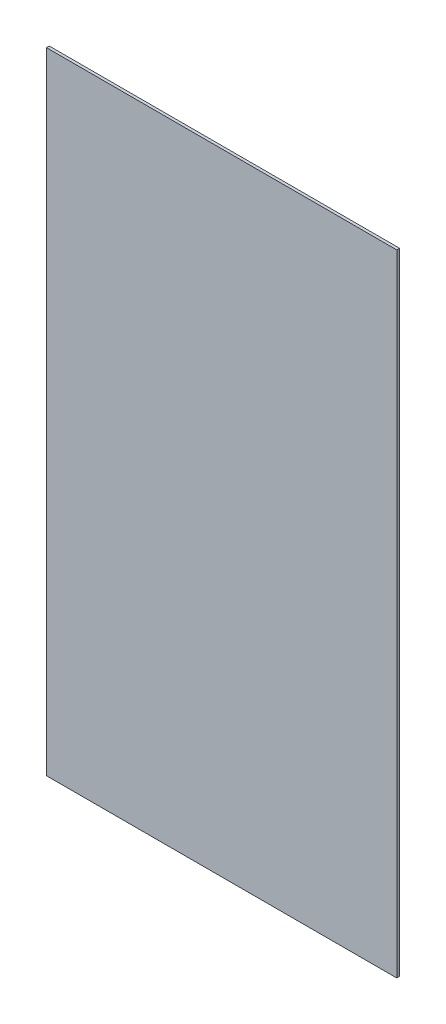
ISO-10303-21;
HEADER;
FILE_DESCRIPTION(('STEP AP214'),'2;1');
FILE_NAME('part.step','',(''),(''),'','','');
FILE_SCHEMA(('AUTOMOTIVE_DESIGN { 1 0 10303 214 1 1 1 1 }'));
ENDSEC;
DATA;
#1=APPLICATION_CONTEXT('core data for automotive mechanical design processes');
#2=APPLICATION_PROTOCOL_DEFINITION('international standard','automotive_design',2000,#1);
#3=PRODUCT_CONTEXT('',#1,'mechanical');
#4=PRODUCT('Part','Part','',(#3));
#5=PRODUCT_RELATED_PRODUCT_CATEGORY('part','',(#4));
#6=PRODUCT_DEFINITION_FORMATION('','',#4);
#7=PRODUCT_DEFINITION_CONTEXT('part definition',#1,'design');
#8=PRODUCT_DEFINITION('design','',#6,#7);
#9=PRODUCT_DEFINITION_SHAPE('','',#8);
#10=(LENGTH_UNIT() NAMED_UNIT(*) SI_UNIT(.MILLI.,.METRE.));
#11=(NAMED_UNIT(*) PLANE_ANGLE_UNIT() SI_UNIT($,.RADIAN.));
#12=(NAMED_UNIT(*) SI_UNIT($,.STERADIAN.) SOLID_ANGLE_UNIT());
#13=UNCERTAINTY_MEASURE_WITH_UNIT(LENGTH_MEASURE(1.E-05),#10,'distance_accuracy_value','');
#14=(GEOMETRIC_REPRESENTATION_CONTEXT(3) GLOBAL_UNCERTAINTY_ASSIGNED_CONTEXT((#13)) GLOBAL_UNIT_ASSIGNED_CONTEXT((#10,
#11,#12)) REPRESENTATION_CONTEXT('',''));
#15=CARTESIAN_POINT('',(0.,0.,0.));
#16=DIRECTION('',(0.,0.,1.));
#17=DIRECTION('',(1.,0.,0.));
#18=AXIS2_PLACEMENT_3D('',#15,#16,#17);
#19=CARTESIAN_POINT('',(0.,0.,0.2));
#20=DIRECTION('',(1.,0.,0.));
#21=DIRECTION('',(0.,0.,-1.));
#22=AXIS2_PLACEMENT_3D('',#19,#20,#21);
#23=PLANE('',#22);
#24=DIRECTION('',(0.,-1.,0.));
#25=VECTOR('',#24,1.);
#26=CARTESIAN_POINT('',(0.,0.,0.));
#27=LINE('',#26,#25);
#28=CARTESIAN_POINT('',(0.,45.,0.));
#29=VERTEX_POINT('',#28);
#30=CARTESIAN_POINT('',(0.,0.,0.));
#31=VERTEX_POINT('',#30);
#32=EDGE_CURVE('E107',#29,#31,#27,.T.);
#33=ORIENTED_EDGE('',*,*,#32,.T.);
#34=DIRECTION('',(0.,0.,-1.));
#35=VECTOR('',#34,1.);
#36=CARTESIAN_POINT('',(0.,0.,0.2));
#37=LINE('',#36,#35);
#38=CARTESIAN_POINT('',(0.,0.,0.2));
#39=VERTEX_POINT('',#38);
#40=EDGE_CURVE('E11',#39,#31,#37,.T.);
#41=ORIENTED_EDGE('',*,*,#40,.F.);
#42=DIRECTION('',(0.,-1.,0.));
#43=VECTOR('',#42,1.);
#44=CARTESIAN_POINT('',(0.,0.,0.2));
#45=LINE('',#44,#43);
#46=CARTESIAN_POINT('',(0.,45.,0.2));
#47=VERTEX_POINT('',#46);
#48=EDGE_CURVE('E91',#47,#39,#45,.T.);
#49=ORIENTED_EDGE('',*,*,#48,.F.);
#50=DIRECTION('',(0.,0.,-1.));
#51=VECTOR('',#50,1.);
#52=CARTESIAN_POINT('',(0.,45.,0.2));
#53=LINE('',#52,#51);
#54=EDGE_CURVE('E103',#47,#29,#53,.T.);
#55=ORIENTED_EDGE('',*,*,#54,.T.);
#56=EDGE_LOOP('',(#33,#41,#49,#55));
#57=FACE_BOUND('',#56,.T.);
#58=ADVANCED_FACE('F39',(#57),#23,.F.);
#59=CARTESIAN_POINT('',(0.,0.,0.2));
#60=DIRECTION('',(0.,1.,0.));
#61=DIRECTION('',(0.,0.,1.));
#62=AXIS2_PLACEMENT_3D('',#59,#60,#61);
#63=PLANE('',#62);
#64=DIRECTION('',(1.,0.,0.));
#65=VECTOR('',#64,1.);
#66=CARTESIAN_POINT('',(0.,0.,0.));
#67=LINE('',#66,#65);
#68=CARTESIAN_POINT('',(25.,0.,0.));
#69=VERTEX_POINT('',#68);
#70=EDGE_CURVE('E96',#31,#69,#67,.T.);
#71=ORIENTED_EDGE('',*,*,#70,.T.);
#72=DIRECTION('',(0.,0.,-1.));
#73=VECTOR('',#72,1.);
#74=CARTESIAN_POINT('',(25.,0.,0.2));
#75=LINE('',#74,#73);
#76=CARTESIAN_POINT('',(25.,0.,0.2));
#77=VERTEX_POINT('',#76);
#78=EDGE_CURVE('E48',#77,#69,#75,.T.);
#79=ORIENTED_EDGE('',*,*,#78,.F.);
#80=DIRECTION('',(1.,0.,0.));
#81=VECTOR('',#80,1.);
#82=CARTESIAN_POINT('',(0.,0.,0.2));
#83=LINE('',#82,#81);
#84=EDGE_CURVE('E86',#39,#77,#83,.T.);
#85=ORIENTED_EDGE('',*,*,#84,.F.);
#86=ORIENTED_EDGE('',*,*,#40,.T.);
#87=EDGE_LOOP('',(#71,#79,#85,#86));
#88=FACE_BOUND('',#87,.T.);
#89=ADVANCED_FACE('F95',(#88),#63,.F.);
#90=CARTESIAN_POINT('',(25.,0.,0.2));
#91=DIRECTION('',(-1.,0.,0.));
#92=DIRECTION('',(0.,0.,1.));
#93=AXIS2_PLACEMENT_3D('',#90,#91,#92);
#94=PLANE('',#93);
#95=DIRECTION('',(0.,1.,0.));
#96=VECTOR('',#95,1.);
#97=CARTESIAN_POINT('',(25.,0.,0.));
#98=LINE('',#97,#96);
#99=CARTESIAN_POINT('',(25.,45.,0.));
#100=VERTEX_POINT('',#99);
#101=EDGE_CURVE('E73',#69,#100,#98,.T.);
#102=ORIENTED_EDGE('',*,*,#101,.T.);
#103=DIRECTION('',(0.,0.,-1.));
#104=VECTOR('',#103,1.);
#105=CARTESIAN_POINT('',(25.,45.,0.2));
#106=LINE('',#105,#104);
#107=CARTESIAN_POINT('',(25.,45.,0.2));
#108=VERTEX_POINT('',#107);
#109=EDGE_CURVE('E98',#108,#100,#106,.T.);
#110=ORIENTED_EDGE('',*,*,#109,.F.);
#111=DIRECTION('',(0.,1.,0.));
#112=VECTOR('',#111,1.);
#113=CARTESIAN_POINT('',(25.,0.,0.2));
#114=LINE('',#113,#112);
#115=EDGE_CURVE('E89',#77,#108,#114,.T.);
#116=ORIENTED_EDGE('',*,*,#115,.F.);
#117=ORIENTED_EDGE('',*,*,#78,.T.);
#118=EDGE_LOOP('',(#102,#110,#116,#117));
#119=FACE_BOUND('',#118,.T.);
#120=ADVANCED_FACE('F99',(#119),#94,.F.);
#121=CARTESIAN_POINT('',(0.,45.,0.2));
#122=DIRECTION('',(0.,-1.,0.));
#123=DIRECTION('',(0.,0.,-1.));
#124=AXIS2_PLACEMENT_3D('',#121,#122,#123);
#125=PLANE('',#124);
#126=DIRECTION('',(-1.,0.,0.));
#127=VECTOR('',#126,1.);
#128=CARTESIAN_POINT('',(0.,45.,0.));
#129=LINE('',#128,#127);
#130=EDGE_CURVE('E79',#100,#29,#129,.T.);
#131=ORIENTED_EDGE('',*,*,#130,.T.);
#132=ORIENTED_EDGE('',*,*,#54,.F.);
#133=DIRECTION('',(-1.,0.,0.));
#134=VECTOR('',#133,1.);
#135=CARTESIAN_POINT('',(0.,45.,0.2));
#136=LINE('',#135,#134);
#137=EDGE_CURVE('E56',#108,#47,#136,.T.);
#138=ORIENTED_EDGE('',*,*,#137,.F.);
#139=ORIENTED_EDGE('',*,*,#109,.T.);
#140=EDGE_LOOP('',(#131,#132,#138,#139));
#141=FACE_BOUND('',#140,.T.);
#142=ADVANCED_FACE('F120',(#141),#125,.F.);
#143=CARTESIAN_POINT('',(0.,0.,0.2));
#144=DIRECTION('',(0.,0.,-1.));
#145=DIRECTION('',(-1.,0.,0.));
#146=AXIS2_PLACEMENT_3D('',#143,#144,#145);
#147=PLANE('',#146);
#148=ORIENTED_EDGE('',*,*,#48,.T.);
#149=ORIENTED_EDGE('',*,*,#84,.T.);
#150=ORIENTED_EDGE('',*,*,#115,.T.);
#151=ORIENTED_EDGE('',*,*,#137,.T.);
#152=EDGE_LOOP('',(#148,#149,#150,#151));
#153=FACE_BOUND('',#152,.T.);
#154=ADVANCED_FACE('F87',(#153),#147,.F.);
#155=CARTESIAN_POINT('',(0.,0.,0.));
#156=DIRECTION('',(0.,0.,-1.));
#157=DIRECTION('',(-1.,0.,0.));
#158=AXIS2_PLACEMENT_3D('',#155,#156,#157);
#159=PLANE('',#158);
#160=ORIENTED_EDGE('',*,*,#32,.F.);
#161=ORIENTED_EDGE('',*,*,#130,.F.);
#162=ORIENTED_EDGE('',*,*,#101,.F.);
#163=ORIENTED_EDGE('',*,*,#70,.F.);
#164=EDGE_LOOP('',(#160,#161,#162,#163));
#165=FACE_BOUND('',#164,.T.);
#166=ADVANCED_FACE('F123',(#165),#159,.T.);
#167=CLOSED_SHELL('',(#58,#89,#120,#142,#154,#166));
#168=MANIFOLD_SOLID_BREP('B2',#167);
#169=ADVANCED_BREP_SHAPE_REPRESENTATION('',(#18,#168),#14);
#170=SHAPE_DEFINITION_REPRESENTATION(#9,#169);
ENDSEC;
END-ISO-10303-21;
